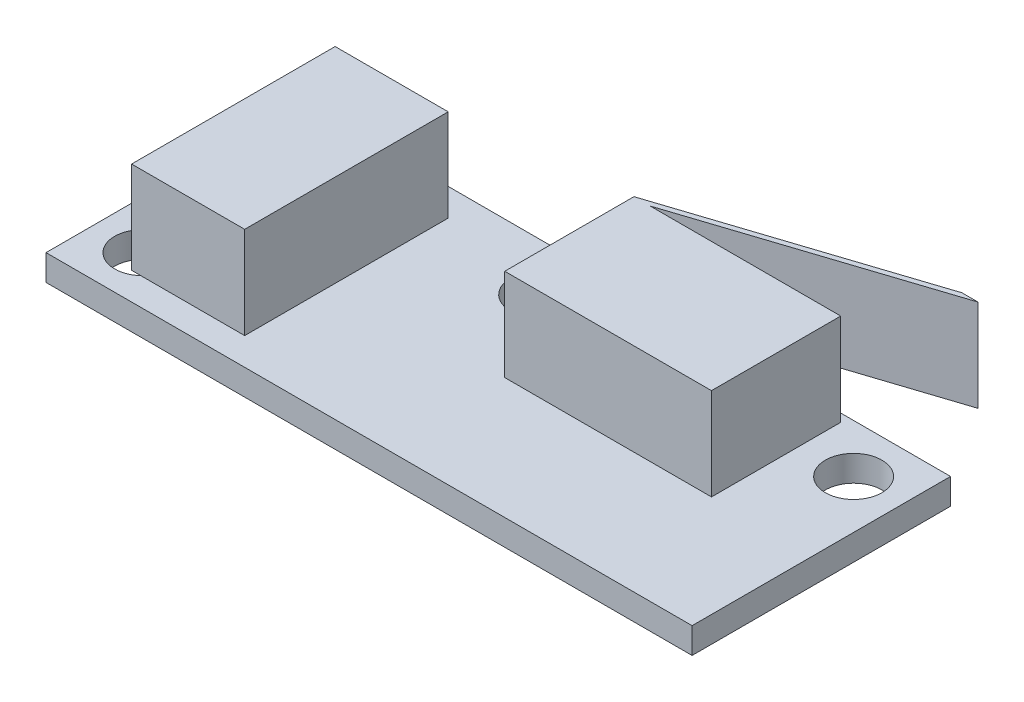
ISO-10303-21;
HEADER;
FILE_DESCRIPTION(('STEP AP214'),'2;1');
FILE_NAME('part.step','',(''),(''),'','','');
FILE_SCHEMA(('AUTOMOTIVE_DESIGN { 1 0 10303 214 1 1 1 1 }'));
ENDSEC;
DATA;
#1=APPLICATION_CONTEXT('core data for automotive mechanical design processes');
#2=APPLICATION_PROTOCOL_DEFINITION('international standard','automotive_design',2000,#1);
#3=PRODUCT_CONTEXT('',#1,'mechanical');
#4=PRODUCT('Part','Part','',(#3));
#5=PRODUCT_RELATED_PRODUCT_CATEGORY('part','',(#4));
#6=PRODUCT_DEFINITION_FORMATION('','',#4);
#7=PRODUCT_DEFINITION_CONTEXT('part definition',#1,'design');
#8=PRODUCT_DEFINITION('design','',#6,#7);
#9=PRODUCT_DEFINITION_SHAPE('','',#8);
#10=(LENGTH_UNIT() NAMED_UNIT(*) SI_UNIT(.MILLI.,.METRE.));
#11=(NAMED_UNIT(*) PLANE_ANGLE_UNIT() SI_UNIT($,.RADIAN.));
#12=(NAMED_UNIT(*) SI_UNIT($,.STERADIAN.) SOLID_ANGLE_UNIT());
#13=UNCERTAINTY_MEASURE_WITH_UNIT(LENGTH_MEASURE(1.E-05),#10,'distance_accuracy_value','');
#14=(GEOMETRIC_REPRESENTATION_CONTEXT(3) GLOBAL_UNCERTAINTY_ASSIGNED_CONTEXT((#13)) GLOBAL_UNIT_ASSIGNED_CONTEXT((#10,
#11,#12)) REPRESENTATION_CONTEXT('',''));
#15=CARTESIAN_POINT('',(0.,0.,0.));
#16=DIRECTION('',(0.,0.,1.));
#17=DIRECTION('',(1.,0.,0.));
#18=AXIS2_PLACEMENT_3D('',#15,#16,#17);
#19=CARTESIAN_POINT('',(0.,1.6,0.));
#20=DIRECTION('',(0.,1.,0.));
#21=DIRECTION('',(0.,0.,1.));
#22=AXIS2_PLACEMENT_3D('',#19,#20,#21);
#23=PLANE('',#22);
#24=DIRECTION('',(-0.950530606221033,0.,0.310630917065697));
#25=VECTOR('',#24,1.);
#26=CARTESIAN_POINT('',(0.9,1.6,-7.5));
#27=LINE('',#26,#25);
#28=CARTESIAN_POINT('',(2.43000000000001,1.6,-8.));
#29=VERTEX_POINT('',#28);
#30=CARTESIAN_POINT('',(0.9,1.6,-7.5));
#31=VERTEX_POINT('',#30);
#32=EDGE_CURVE('E11',#29,#31,#27,.T.);
#33=ORIENTED_EDGE('',*,*,#32,.F.);
#34=DIRECTION('',(-1.,0.,0.));
#35=VECTOR('',#34,1.);
#36=CARTESIAN_POINT('',(-20.,1.6,-8.));
#37=LINE('',#36,#35);
#38=CARTESIAN_POINT('',(-20.,1.6,-8.));
#39=VERTEX_POINT('',#38);
#40=EDGE_CURVE('E272',#29,#39,#37,.T.);
#41=ORIENTED_EDGE('',*,*,#40,.T.);
#42=DIRECTION('',(0.,0.,1.));
#43=VECTOR('',#42,1.);
#44=CARTESIAN_POINT('',(-20.,1.6,-8.));
#45=LINE('',#44,#43);
#46=CARTESIAN_POINT('',(-20.,1.6,8.));
#47=VERTEX_POINT('',#46);
#48=EDGE_CURVE('E277',#39,#47,#45,.T.);
#49=ORIENTED_EDGE('',*,*,#48,.T.);
#50=DIRECTION('',(1.,0.,0.));
#51=VECTOR('',#50,1.);
#52=CARTESIAN_POINT('',(-20.,1.6,8.));
#53=LINE('',#52,#51);
#54=CARTESIAN_POINT('',(20.,1.6,8.));
#55=VERTEX_POINT('',#54);
#56=EDGE_CURVE('E280',#47,#55,#53,.T.);
#57=ORIENTED_EDGE('',*,*,#56,.T.);
#58=DIRECTION('',(0.,0.,-1.));
#59=VECTOR('',#58,1.);
#60=CARTESIAN_POINT('',(20.,1.6,-8.));
#61=LINE('',#60,#59);
#62=CARTESIAN_POINT('',(20.,1.6,-8.));
#63=VERTEX_POINT('',#62);
#64=EDGE_CURVE('E269',#55,#63,#61,.T.);
#65=ORIENTED_EDGE('',*,*,#64,.T.);
#66=CARTESIAN_POINT('',(3.43000000000004,1.6,-8.00000000000001));
#67=VERTEX_POINT('',#66);
#68=EDGE_CURVE('E274',#63,#67,#37,.T.);
#69=ORIENTED_EDGE('',*,*,#68,.T.);
#70=DIRECTION('',(0.950530606221033,0.,-0.310630917065697));
#71=VECTOR('',#70,1.);
#72=CARTESIAN_POINT('',(17.2,1.6,-12.5));
#73=LINE('',#72,#71);
#74=CARTESIAN_POINT('',(1.9,1.6,-7.5));
#75=VERTEX_POINT('',#74);
#76=EDGE_CURVE('E216',#75,#67,#73,.T.);
#77=ORIENTED_EDGE('',*,*,#76,.F.);
#78=DIRECTION('',(-1.,0.,0.));
#79=VECTOR('',#78,1.);
#80=CARTESIAN_POINT('',(1.9,1.6,-7.5));
#81=LINE('',#80,#79);
#82=CARTESIAN_POINT('',(13.7,1.6,-7.5));
#83=VERTEX_POINT('',#82);
#84=EDGE_CURVE('E212',#83,#75,#81,.T.);
#85=ORIENTED_EDGE('',*,*,#84,.F.);
#86=DIRECTION('',(0.,0.,-1.));
#87=VECTOR('',#86,1.);
#88=CARTESIAN_POINT('',(13.7,1.6,-7.5));
#89=LINE('',#88,#87);
#90=CARTESIAN_POINT('',(13.7,1.6,0.499999999999999));
#91=VERTEX_POINT('',#90);
#92=EDGE_CURVE('E209',#91,#83,#89,.T.);
#93=ORIENTED_EDGE('',*,*,#92,.F.);
#94=DIRECTION('',(1.,0.,0.));
#95=VECTOR('',#94,1.);
#96=CARTESIAN_POINT('',(0.900000000000001,1.6,0.499999999999999));
#97=LINE('',#96,#95);
#98=CARTESIAN_POINT('',(0.900000000000001,1.6,0.499999999999999));
#99=VERTEX_POINT('',#98);
#100=EDGE_CURVE('E185',#99,#91,#97,.T.);
#101=ORIENTED_EDGE('',*,*,#100,.F.);
#102=DIRECTION('',(0.,0.,1.));
#103=VECTOR('',#102,1.);
#104=CARTESIAN_POINT('',(0.9,1.6,-7.5));
#105=LINE('',#104,#103);
#106=EDGE_CURVE('E58',#31,#99,#105,.T.);
#107=ORIENTED_EDGE('',*,*,#106,.F.);
#108=EDGE_LOOP('',(#33,#41,#49,#57,#65,#69,#77,#85,#93,#101,#107));
#109=FACE_BOUND('',#108,.T.);
#110=CARTESIAN_POINT('',(17.,1.6,-5.));
#111=DIRECTION('',(0.,1.,0.));
#112=DIRECTION('',(0.,0.,1.));
#113=AXIS2_PLACEMENT_3D('',#110,#111,#112);
#114=CIRCLE('',#113,1.75);
#115=CARTESIAN_POINT('',(17.,1.6,-3.25));
#116=VERTEX_POINT('',#115);
#117=EDGE_CURVE('E243',#116,#116,#114,.T.);
#118=ORIENTED_EDGE('',*,*,#117,.F.);
#119=EDGE_LOOP('',(#118));
#120=FACE_BOUND('',#119,.T.);
#121=CARTESIAN_POINT('',(-2.5,1.6,-5.));
#122=DIRECTION('',(0.,1.,0.));
#123=DIRECTION('',(0.,0.,1.));
#124=AXIS2_PLACEMENT_3D('',#121,#122,#123);
#125=CIRCLE('',#124,1.75);
#126=CARTESIAN_POINT('',(-2.5,1.6,-3.25));
#127=VERTEX_POINT('',#126);
#128=EDGE_CURVE('E249',#127,#127,#125,.T.);
#129=ORIENTED_EDGE('',*,*,#128,.F.);
#130=EDGE_LOOP('',(#129));
#131=FACE_BOUND('',#130,.T.);
#132=CARTESIAN_POINT('',(-17.,1.6,5.));
#133=DIRECTION('',(0.,1.,0.));
#134=DIRECTION('',(0.,0.,1.));
#135=AXIS2_PLACEMENT_3D('',#132,#133,#134);
#136=CIRCLE('',#135,1.75);
#137=CARTESIAN_POINT('',(-16.4,1.6,3.35607177772264));
#138=VERTEX_POINT('',#137);
#139=CARTESIAN_POINT('',(-15.828462548614,1.6,6.3));
#140=VERTEX_POINT('',#139);
#141=EDGE_CURVE('E259',#138,#140,#136,.T.);
#142=ORIENTED_EDGE('',*,*,#141,.F.);
#143=DIRECTION('',(0.,0.,1.));
#144=VECTOR('',#143,1.);
#145=CARTESIAN_POINT('',(-16.4,1.6,-6.3));
#146=LINE('',#145,#144);
#147=CARTESIAN_POINT('',(-16.4,1.6,-3.35607177772264));
#148=VERTEX_POINT('',#147);
#149=EDGE_CURVE('E50',#148,#138,#146,.T.);
#150=ORIENTED_EDGE('',*,*,#149,.F.);
#151=CARTESIAN_POINT('',(-17.,1.6,-5.));
#152=DIRECTION('',(0.,1.,0.));
#153=DIRECTION('',(0.,0.,1.));
#154=AXIS2_PLACEMENT_3D('',#151,#152,#153);
#155=CIRCLE('',#154,1.75);
#156=CARTESIAN_POINT('',(-15.828462548614,1.6,-6.3));
#157=VERTEX_POINT('',#156);
#158=EDGE_CURVE('E266',#157,#148,#155,.T.);
#159=ORIENTED_EDGE('',*,*,#158,.F.);
#160=DIRECTION('',(-1.,0.,0.));
#161=VECTOR('',#160,1.);
#162=CARTESIAN_POINT('',(-16.4,1.6,-6.3));
#163=LINE('',#162,#161);
#164=CARTESIAN_POINT('',(-9.4,1.6,-6.3));
#165=VERTEX_POINT('',#164);
#166=EDGE_CURVE('E179',#165,#157,#163,.T.);
#167=ORIENTED_EDGE('',*,*,#166,.F.);
#168=DIRECTION('',(0.,0.,-1.));
#169=VECTOR('',#168,1.);
#170=CARTESIAN_POINT('',(-9.4,1.6,-6.3));
#171=LINE('',#170,#169);
#172=CARTESIAN_POINT('',(-9.4,1.6,6.3));
#173=VERTEX_POINT('',#172);
#174=EDGE_CURVE('E563',#173,#165,#171,.T.);
#175=ORIENTED_EDGE('',*,*,#174,.F.);
#176=DIRECTION('',(1.,0.,0.));
#177=VECTOR('',#176,1.);
#178=CARTESIAN_POINT('',(-16.4,1.6,6.3));
#179=LINE('',#178,#177);
#180=EDGE_CURVE('E556',#140,#173,#179,.T.);
#181=ORIENTED_EDGE('',*,*,#180,.F.);
#182=EDGE_LOOP('',(#142,#150,#159,#167,#175,#181));
#183=FACE_BOUND('',#182,.T.);
#184=ADVANCED_FACE('F33',(#109,#120,#131,#183),#23,.T.);
#185=CARTESIAN_POINT('',(20.,1.6,-8.));
#186=DIRECTION('',(-1.,0.,0.));
#187=DIRECTION('',(0.,0.,1.));
#188=AXIS2_PLACEMENT_3D('',#185,#186,#187);
#189=PLANE('',#188);
#190=DIRECTION('',(0.,0.,-1.));
#191=VECTOR('',#190,1.);
#192=CARTESIAN_POINT('',(20.,0.,-8.));
#193=LINE('',#192,#191);
#194=CARTESIAN_POINT('',(20.,0.,8.));
#195=VERTEX_POINT('',#194);
#196=CARTESIAN_POINT('',(20.,0.,-8.));
#197=VERTEX_POINT('',#196);
#198=EDGE_CURVE('E265',#195,#197,#193,.T.);
#199=ORIENTED_EDGE('',*,*,#198,.T.);
#200=DIRECTION('',(0.,-1.,0.));
#201=VECTOR('',#200,1.);
#202=CARTESIAN_POINT('',(20.,1.6,-8.));
#203=LINE('',#202,#201);
#204=EDGE_CURVE('E37',#63,#197,#203,.T.);
#205=ORIENTED_EDGE('',*,*,#204,.F.);
#206=ORIENTED_EDGE('',*,*,#64,.F.);
#207=DIRECTION('',(0.,-1.,0.));
#208=VECTOR('',#207,1.);
#209=CARTESIAN_POINT('',(20.,1.6,8.));
#210=LINE('',#209,#208);
#211=EDGE_CURVE('E282',#55,#195,#210,.T.);
#212=ORIENTED_EDGE('',*,*,#211,.T.);
#213=EDGE_LOOP('',(#199,#205,#206,#212));
#214=FACE_BOUND('',#213,.T.);
#215=ADVANCED_FACE('F35',(#214),#189,.F.);
#216=CARTESIAN_POINT('',(-20.,1.6,-8.));
#217=DIRECTION('',(0.,0.,1.));
#218=DIRECTION('',(1.,0.,0.));
#219=AXIS2_PLACEMENT_3D('',#216,#217,#218);
#220=PLANE('',#219);
#221=DIRECTION('',(-1.,0.,0.));
#222=VECTOR('',#221,1.);
#223=CARTESIAN_POINT('',(-20.,0.,-8.));
#224=LINE('',#223,#222);
#225=CARTESIAN_POINT('',(-20.,0.,-8.));
#226=VERTEX_POINT('',#225);
#227=EDGE_CURVE('E285',#197,#226,#224,.T.);
#228=ORIENTED_EDGE('',*,*,#227,.T.);
#229=DIRECTION('',(0.,-1.,0.));
#230=VECTOR('',#229,1.);
#231=CARTESIAN_POINT('',(-20.,1.6,-8.));
#232=LINE('',#231,#230);
#233=EDGE_CURVE('E294',#39,#226,#232,.T.);
#234=ORIENTED_EDGE('',*,*,#233,.F.);
#235=ORIENTED_EDGE('',*,*,#40,.F.);
#236=EDGE_CURVE('E278',#67,#29,#37,.T.);
#237=ORIENTED_EDGE('',*,*,#236,.F.);
#238=ORIENTED_EDGE('',*,*,#68,.F.);
#239=ORIENTED_EDGE('',*,*,#204,.T.);
#240=EDGE_LOOP('',(#228,#234,#235,#237,#238,#239));
#241=FACE_BOUND('',#240,.T.);
#242=ADVANCED_FACE('F303',(#241),#220,.F.);
#243=CARTESIAN_POINT('',(-20.,1.6,-8.));
#244=DIRECTION('',(1.,0.,0.));
#245=DIRECTION('',(0.,0.,-1.));
#246=AXIS2_PLACEMENT_3D('',#243,#244,#245);
#247=PLANE('',#246);
#248=DIRECTION('',(0.,0.,1.));
#249=VECTOR('',#248,1.);
#250=CARTESIAN_POINT('',(-20.,0.,-8.));
#251=LINE('',#250,#249);
#252=CARTESIAN_POINT('',(-20.,0.,8.));
#253=VERTEX_POINT('',#252);
#254=EDGE_CURVE('E287',#226,#253,#251,.T.);
#255=ORIENTED_EDGE('',*,*,#254,.T.);
#256=DIRECTION('',(0.,-1.,0.));
#257=VECTOR('',#256,1.);
#258=CARTESIAN_POINT('',(-20.,1.6,8.));
#259=LINE('',#258,#257);
#260=EDGE_CURVE('E292',#47,#253,#259,.T.);
#261=ORIENTED_EDGE('',*,*,#260,.F.);
#262=ORIENTED_EDGE('',*,*,#48,.F.);
#263=ORIENTED_EDGE('',*,*,#233,.T.);
#264=EDGE_LOOP('',(#255,#261,#262,#263));
#265=FACE_BOUND('',#264,.T.);
#266=ADVANCED_FACE('F312',(#265),#247,.F.);
#267=CARTESIAN_POINT('',(-20.,1.6,8.));
#268=DIRECTION('',(0.,0.,-1.));
#269=DIRECTION('',(-1.,0.,0.));
#270=AXIS2_PLACEMENT_3D('',#267,#268,#269);
#271=PLANE('',#270);
#272=DIRECTION('',(1.,0.,0.));
#273=VECTOR('',#272,1.);
#274=CARTESIAN_POINT('',(-20.,0.,8.));
#275=LINE('',#274,#273);
#276=EDGE_CURVE('E273',#253,#195,#275,.T.);
#277=ORIENTED_EDGE('',*,*,#276,.T.);
#278=ORIENTED_EDGE('',*,*,#211,.F.);
#279=ORIENTED_EDGE('',*,*,#56,.F.);
#280=ORIENTED_EDGE('',*,*,#260,.T.);
#281=EDGE_LOOP('',(#277,#278,#279,#280));
#282=FACE_BOUND('',#281,.T.);
#283=ADVANCED_FACE('F315',(#282),#271,.F.);
#284=CARTESIAN_POINT('',(0.,0.,0.));
#285=DIRECTION('',(0.,1.,0.));
#286=DIRECTION('',(0.,0.,1.));
#287=AXIS2_PLACEMENT_3D('',#284,#285,#286);
#288=PLANE('',#287);
#289=CARTESIAN_POINT('',(17.,0.,-5.));
#290=DIRECTION('',(0.,1.,0.));
#291=DIRECTION('',(0.,0.,1.));
#292=AXIS2_PLACEMENT_3D('',#289,#290,#291);
#293=CIRCLE('',#292,1.75);
#294=CARTESIAN_POINT('',(17.,0.,-3.25));
#295=VERTEX_POINT('',#294);
#296=EDGE_CURVE('E242',#295,#295,#293,.T.);
#297=ORIENTED_EDGE('',*,*,#296,.T.);
#298=EDGE_LOOP('',(#297));
#299=FACE_BOUND('',#298,.T.);
#300=CARTESIAN_POINT('',(-2.5,0.,-5.));
#301=DIRECTION('',(0.,1.,0.));
#302=DIRECTION('',(0.,0.,1.));
#303=AXIS2_PLACEMENT_3D('',#300,#301,#302);
#304=CIRCLE('',#303,1.75);
#305=CARTESIAN_POINT('',(-2.5,0.,-3.25));
#306=VERTEX_POINT('',#305);
#307=EDGE_CURVE('E246',#306,#306,#304,.T.);
#308=ORIENTED_EDGE('',*,*,#307,.T.);
#309=EDGE_LOOP('',(#308));
#310=FACE_BOUND('',#309,.T.);
#311=CARTESIAN_POINT('',(-17.,0.,5.));
#312=DIRECTION('',(0.,1.,0.));
#313=DIRECTION('',(0.,0.,1.));
#314=AXIS2_PLACEMENT_3D('',#311,#312,#313);
#315=CIRCLE('',#314,1.75);
#316=CARTESIAN_POINT('',(-17.,0.,6.75));
#317=VERTEX_POINT('',#316);
#318=EDGE_CURVE('E252',#317,#317,#315,.T.);
#319=ORIENTED_EDGE('',*,*,#318,.T.);
#320=EDGE_LOOP('',(#319));
#321=FACE_BOUND('',#320,.T.);
#322=CARTESIAN_POINT('',(-17.,0.,-5.));
#323=DIRECTION('',(0.,1.,0.));
#324=DIRECTION('',(0.,0.,1.));
#325=AXIS2_PLACEMENT_3D('',#322,#323,#324);
#326=CIRCLE('',#325,1.75);
#327=CARTESIAN_POINT('',(-17.,0.,-3.25));
#328=VERTEX_POINT('',#327);
#329=EDGE_CURVE('E258',#328,#328,#326,.T.);
#330=ORIENTED_EDGE('',*,*,#329,.T.);
#331=EDGE_LOOP('',(#330));
#332=FACE_BOUND('',#331,.T.);
#333=ORIENTED_EDGE('',*,*,#198,.F.);
#334=ORIENTED_EDGE('',*,*,#276,.F.);
#335=ORIENTED_EDGE('',*,*,#254,.F.);
#336=ORIENTED_EDGE('',*,*,#227,.F.);
#337=EDGE_LOOP('',(#333,#334,#335,#336));
#338=FACE_BOUND('',#337,.T.);
#339=ADVANCED_FACE('F310',(#299,#310,#321,#332,#338),#288,.F.);
#340=CARTESIAN_POINT('',(-17.,1.6,-5.));
#341=DIRECTION('',(0.,-1.,0.));
#342=DIRECTION('',(0.,0.,-1.));
#343=AXIS2_PLACEMENT_3D('',#340,#341,#342);
#344=CYLINDRICAL_SURFACE('',#343,1.75);
#345=EDGE_CURVE('E262',#148,#157,#155,.T.);
#346=ORIENTED_EDGE('',*,*,#345,.T.);
#347=ORIENTED_EDGE('',*,*,#158,.T.);
#348=EDGE_LOOP('',(#346,#347));
#349=FACE_BOUND('',#348,.T.);
#350=ORIENTED_EDGE('',*,*,#329,.F.);
#351=EDGE_LOOP('',(#350));
#352=FACE_BOUND('',#351,.T.);
#353=ADVANCED_FACE('F373',(#349,#352),#344,.F.);
#354=CARTESIAN_POINT('',(-17.,1.6,5.));
#355=DIRECTION('',(0.,-1.,0.));
#356=DIRECTION('',(0.,0.,-1.));
#357=AXIS2_PLACEMENT_3D('',#354,#355,#356);
#358=CYLINDRICAL_SURFACE('',#357,1.75);
#359=EDGE_CURVE('E255',#140,#138,#136,.T.);
#360=ORIENTED_EDGE('',*,*,#359,.T.);
#361=ORIENTED_EDGE('',*,*,#141,.T.);
#362=EDGE_LOOP('',(#360,#361));
#363=FACE_BOUND('',#362,.T.);
#364=ORIENTED_EDGE('',*,*,#318,.F.);
#365=EDGE_LOOP('',(#364));
#366=FACE_BOUND('',#365,.T.);
#367=ADVANCED_FACE('F407',(#363,#366),#358,.F.);
#368=CARTESIAN_POINT('',(-2.5,1.6,-5.));
#369=DIRECTION('',(0.,-1.,0.));
#370=DIRECTION('',(0.,0.,-1.));
#371=AXIS2_PLACEMENT_3D('',#368,#369,#370);
#372=CYLINDRICAL_SURFACE('',#371,1.75);
#373=ORIENTED_EDGE('',*,*,#128,.T.);
#374=EDGE_LOOP('',(#373));
#375=FACE_BOUND('',#374,.T.);
#376=ORIENTED_EDGE('',*,*,#307,.F.);
#377=EDGE_LOOP('',(#376));
#378=FACE_BOUND('',#377,.T.);
#379=ADVANCED_FACE('F414',(#375,#378),#372,.F.);
#380=CARTESIAN_POINT('',(17.,1.6,-5.));
#381=DIRECTION('',(0.,-1.,0.));
#382=DIRECTION('',(0.,0.,-1.));
#383=AXIS2_PLACEMENT_3D('',#380,#381,#382);
#384=CYLINDRICAL_SURFACE('',#383,1.75);
#385=ORIENTED_EDGE('',*,*,#117,.T.);
#386=EDGE_LOOP('',(#385));
#387=FACE_BOUND('',#386,.T.);
#388=ORIENTED_EDGE('',*,*,#296,.F.);
#389=EDGE_LOOP('',(#388));
#390=FACE_BOUND('',#389,.T.);
#391=ADVANCED_FACE('F421',(#387,#390),#384,.F.);
#392=CARTESIAN_POINT('',(0.,1.6,0.));
#393=DIRECTION('',(0.,1.,0.));
#394=DIRECTION('',(0.,0.,1.));
#395=AXIS2_PLACEMENT_3D('',#392,#393,#394);
#396=PLANE('',#395);
#397=CARTESIAN_POINT('',(17.2,1.6,-12.5));
#398=VERTEX_POINT('',#397);
#399=EDGE_CURVE('E215',#67,#398,#73,.T.);
#400=ORIENTED_EDGE('',*,*,#399,.F.);
#401=ORIENTED_EDGE('',*,*,#236,.T.);
#402=CARTESIAN_POINT('',(16.2,1.6,-12.5));
#403=VERTEX_POINT('',#402);
#404=EDGE_CURVE('E43',#403,#29,#27,.T.);
#405=ORIENTED_EDGE('',*,*,#404,.F.);
#406=DIRECTION('',(-1.,0.,0.));
#407=VECTOR('',#406,1.);
#408=CARTESIAN_POINT('',(16.2,1.6,-12.5));
#409=LINE('',#408,#407);
#410=EDGE_CURVE('E219',#398,#403,#409,.T.);
#411=ORIENTED_EDGE('',*,*,#410,.F.);
#412=EDGE_LOOP('',(#400,#401,#405,#411));
#413=FACE_BOUND('',#412,.T.);
#414=ADVANCED_FACE('F322',(#413),#396,.F.);
#415=CARTESIAN_POINT('',(0.9,7.3,-7.5));
#416=DIRECTION('',(1.,0.,0.));
#417=DIRECTION('',(0.,0.,-1.));
#418=AXIS2_PLACEMENT_3D('',#415,#416,#417);
#419=PLANE('',#418);
#420=ORIENTED_EDGE('',*,*,#106,.T.);
#421=DIRECTION('',(0.,-1.,0.));
#422=VECTOR('',#421,1.);
#423=CARTESIAN_POINT('',(0.900000000000001,7.3,0.499999999999999));
#424=LINE('',#423,#422);
#425=CARTESIAN_POINT('',(0.900000000000001,7.3,0.499999999999999));
#426=VERTEX_POINT('',#425);
#427=EDGE_CURVE('E239',#426,#99,#424,.T.);
#428=ORIENTED_EDGE('',*,*,#427,.F.);
#429=DIRECTION('',(0.,0.,1.));
#430=VECTOR('',#429,1.);
#431=CARTESIAN_POINT('',(0.9,7.3,-7.5));
#432=LINE('',#431,#430);
#433=CARTESIAN_POINT('',(0.9,7.3,-7.5));
#434=VERTEX_POINT('',#433);
#435=EDGE_CURVE('E191',#434,#426,#432,.T.);
#436=ORIENTED_EDGE('',*,*,#435,.F.);
#437=DIRECTION('',(0.,-1.,0.));
#438=VECTOR('',#437,1.);
#439=CARTESIAN_POINT('',(0.9,7.3,-7.5));
#440=LINE('',#439,#438);
#441=EDGE_CURVE('E205',#434,#31,#440,.T.);
#442=ORIENTED_EDGE('',*,*,#441,.T.);
#443=EDGE_LOOP('',(#420,#428,#436,#442));
#444=FACE_BOUND('',#443,.T.);
#445=ADVANCED_FACE('F350',(#444),#419,.F.);
#446=CARTESIAN_POINT('',(0.900000000000001,7.3,0.499999999999999));
#447=DIRECTION('',(0.,0.,-1.));
#448=DIRECTION('',(-1.,0.,0.));
#449=AXIS2_PLACEMENT_3D('',#446,#447,#448);
#450=PLANE('',#449);
#451=ORIENTED_EDGE('',*,*,#100,.T.);
#452=DIRECTION('',(0.,-1.,0.));
#453=VECTOR('',#452,1.);
#454=CARTESIAN_POINT('',(13.7,7.3,0.499999999999999));
#455=LINE('',#454,#453);
#456=CARTESIAN_POINT('',(13.7,7.3,0.499999999999999));
#457=VERTEX_POINT('',#456);
#458=EDGE_CURVE('E236',#457,#91,#455,.T.);
#459=ORIENTED_EDGE('',*,*,#458,.F.);
#460=DIRECTION('',(1.,0.,0.));
#461=VECTOR('',#460,1.);
#462=CARTESIAN_POINT('',(0.900000000000001,7.3,0.499999999999999));
#463=LINE('',#462,#461);
#464=EDGE_CURVE('E194',#426,#457,#463,.T.);
#465=ORIENTED_EDGE('',*,*,#464,.F.);
#466=ORIENTED_EDGE('',*,*,#427,.T.);
#467=EDGE_LOOP('',(#451,#459,#465,#466));
#468=FACE_BOUND('',#467,.T.);
#469=ADVANCED_FACE('F346',(#468),#450,.F.);
#470=CARTESIAN_POINT('',(13.7,7.3,-7.5));
#471=DIRECTION('',(-1.,0.,0.));
#472=DIRECTION('',(0.,0.,1.));
#473=AXIS2_PLACEMENT_3D('',#470,#471,#472);
#474=PLANE('',#473);
#475=ORIENTED_EDGE('',*,*,#92,.T.);
#476=DIRECTION('',(0.,-1.,0.));
#477=VECTOR('',#476,1.);
#478=CARTESIAN_POINT('',(13.7,7.3,-7.5));
#479=LINE('',#478,#477);
#480=CARTESIAN_POINT('',(13.7,7.3,-7.5));
#481=VERTEX_POINT('',#480);
#482=EDGE_CURVE('E233',#481,#83,#479,.T.);
#483=ORIENTED_EDGE('',*,*,#482,.F.);
#484=DIRECTION('',(0.,0.,-1.));
#485=VECTOR('',#484,1.);
#486=CARTESIAN_POINT('',(13.7,7.3,-7.5));
#487=LINE('',#486,#485);
#488=EDGE_CURVE('E196',#457,#481,#487,.T.);
#489=ORIENTED_EDGE('',*,*,#488,.F.);
#490=ORIENTED_EDGE('',*,*,#458,.T.);
#491=EDGE_LOOP('',(#475,#483,#489,#490));
#492=FACE_BOUND('',#491,.T.);
#493=ADVANCED_FACE('F343',(#492),#474,.F.);
#494=CARTESIAN_POINT('',(1.9,7.3,-7.5));
#495=DIRECTION('',(0.,0.,1.));
#496=DIRECTION('',(1.,0.,0.));
#497=AXIS2_PLACEMENT_3D('',#494,#495,#496);
#498=PLANE('',#497);
#499=ORIENTED_EDGE('',*,*,#84,.T.);
#500=DIRECTION('',(0.,-1.,0.));
#501=VECTOR('',#500,1.);
#502=CARTESIAN_POINT('',(1.9,7.3,-7.5));
#503=LINE('',#502,#501);
#504=CARTESIAN_POINT('',(1.9,7.3,-7.5));
#505=VERTEX_POINT('',#504);
#506=EDGE_CURVE('E230',#505,#75,#503,.T.);
#507=ORIENTED_EDGE('',*,*,#506,.F.);
#508=DIRECTION('',(-1.,0.,0.));
#509=VECTOR('',#508,1.);
#510=CARTESIAN_POINT('',(1.9,7.3,-7.5));
#511=LINE('',#510,#509);
#512=EDGE_CURVE('E198',#481,#505,#511,.T.);
#513=ORIENTED_EDGE('',*,*,#512,.F.);
#514=ORIENTED_EDGE('',*,*,#482,.T.);
#515=EDGE_LOOP('',(#499,#507,#513,#514));
#516=FACE_BOUND('',#515,.T.);
#517=ADVANCED_FACE('F338',(#516),#498,.F.);
#518=CARTESIAN_POINT('',(17.2,7.3,-12.5));
#519=DIRECTION('',(-0.310630917065697,0.,-0.950530606221033));
#520=DIRECTION('',(-0.950530606221033,0.,0.310630917065697));
#521=AXIS2_PLACEMENT_3D('',#518,#519,#520);
#522=PLANE('',#521);
#523=ORIENTED_EDGE('',*,*,#76,.T.);
#524=ORIENTED_EDGE('',*,*,#399,.T.);
#525=DIRECTION('',(0.,-1.,0.));
#526=VECTOR('',#525,1.);
#527=CARTESIAN_POINT('',(17.2,7.3,-12.5));
#528=LINE('',#527,#526);
#529=CARTESIAN_POINT('',(17.2,7.3,-12.5));
#530=VERTEX_POINT('',#529);
#531=EDGE_CURVE('E227',#530,#398,#528,.T.);
#532=ORIENTED_EDGE('',*,*,#531,.F.);
#533=DIRECTION('',(0.950530606221033,0.,-0.310630917065697));
#534=VECTOR('',#533,1.);
#535=CARTESIAN_POINT('',(17.2,7.3,-12.5));
#536=LINE('',#535,#534);
#537=EDGE_CURVE('E200',#505,#530,#536,.T.);
#538=ORIENTED_EDGE('',*,*,#537,.F.);
#539=ORIENTED_EDGE('',*,*,#506,.T.);
#540=EDGE_LOOP('',(#523,#524,#532,#538,#539));
#541=FACE_BOUND('',#540,.T.);
#542=ADVANCED_FACE('F335',(#541),#522,.F.);
#543=CARTESIAN_POINT('',(16.2,7.3,-12.5));
#544=DIRECTION('',(0.,0.,1.));
#545=DIRECTION('',(1.,0.,0.));
#546=AXIS2_PLACEMENT_3D('',#543,#544,#545);
#547=PLANE('',#546);
#548=ORIENTED_EDGE('',*,*,#410,.T.);
#549=DIRECTION('',(0.,-1.,0.));
#550=VECTOR('',#549,1.);
#551=CARTESIAN_POINT('',(16.2,7.3,-12.5));
#552=LINE('',#551,#550);
#553=CARTESIAN_POINT('',(16.2,7.3,-12.5));
#554=VERTEX_POINT('',#553);
#555=EDGE_CURVE('E224',#554,#403,#552,.T.);
#556=ORIENTED_EDGE('',*,*,#555,.F.);
#557=DIRECTION('',(-1.,0.,0.));
#558=VECTOR('',#557,1.);
#559=CARTESIAN_POINT('',(16.2,7.3,-12.5));
#560=LINE('',#559,#558);
#561=EDGE_CURVE('E202',#530,#554,#560,.T.);
#562=ORIENTED_EDGE('',*,*,#561,.F.);
#563=ORIENTED_EDGE('',*,*,#531,.T.);
#564=EDGE_LOOP('',(#548,#556,#562,#563));
#565=FACE_BOUND('',#564,.T.);
#566=ADVANCED_FACE('F331',(#565),#547,.F.);
#567=CARTESIAN_POINT('',(0.9,7.3,-7.5));
#568=DIRECTION('',(0.310630917065697,0.,0.950530606221033));
#569=DIRECTION('',(0.950530606221033,0.,-0.310630917065697));
#570=AXIS2_PLACEMENT_3D('',#567,#568,#569);
#571=PLANE('',#570);
#572=ORIENTED_EDGE('',*,*,#404,.T.);
#573=ORIENTED_EDGE('',*,*,#32,.T.);
#574=ORIENTED_EDGE('',*,*,#441,.F.);
#575=DIRECTION('',(-0.950530606221033,0.,0.310630917065697));
#576=VECTOR('',#575,1.);
#577=CARTESIAN_POINT('',(0.9,7.3,-7.5));
#578=LINE('',#577,#576);
#579=EDGE_CURVE('E204',#554,#434,#578,.T.);
#580=ORIENTED_EDGE('',*,*,#579,.F.);
#581=ORIENTED_EDGE('',*,*,#555,.T.);
#582=EDGE_LOOP('',(#572,#573,#574,#580,#581));
#583=FACE_BOUND('',#582,.T.);
#584=ADVANCED_FACE('F325',(#583),#571,.F.);
#585=CARTESIAN_POINT('',(0.,7.3,0.));
#586=DIRECTION('',(0.,1.,0.));
#587=DIRECTION('',(0.,0.,1.));
#588=AXIS2_PLACEMENT_3D('',#585,#586,#587);
#589=PLANE('',#588);
#590=ORIENTED_EDGE('',*,*,#435,.T.);
#591=ORIENTED_EDGE('',*,*,#464,.T.);
#592=ORIENTED_EDGE('',*,*,#488,.T.);
#593=ORIENTED_EDGE('',*,*,#512,.T.);
#594=ORIENTED_EDGE('',*,*,#537,.T.);
#595=ORIENTED_EDGE('',*,*,#561,.T.);
#596=ORIENTED_EDGE('',*,*,#579,.T.);
#597=EDGE_LOOP('',(#590,#591,#592,#593,#594,#595,#596));
#598=FACE_BOUND('',#597,.T.);
#599=ADVANCED_FACE('F352',(#598),#589,.T.);
#600=CARTESIAN_POINT('',(0.,1.6,0.));
#601=DIRECTION('',(0.,1.,0.));
#602=DIRECTION('',(0.,0.,1.));
#603=AXIS2_PLACEMENT_3D('',#600,#601,#602);
#604=PLANE('',#603);
#605=ORIENTED_EDGE('',*,*,#345,.F.);
#606=CARTESIAN_POINT('',(-16.4,1.6,-6.3));
#607=VERTEX_POINT('',#606);
#608=EDGE_CURVE('E554',#607,#148,#146,.T.);
#609=ORIENTED_EDGE('',*,*,#608,.F.);
#610=EDGE_CURVE('E545',#157,#607,#163,.T.);
#611=ORIENTED_EDGE('',*,*,#610,.F.);
#612=EDGE_LOOP('',(#605,#609,#611));
#613=FACE_BOUND('',#612,.T.);
#614=ADVANCED_FACE('F354',(#613),#604,.F.);
#615=ORIENTED_EDGE('',*,*,#359,.F.);
#616=CARTESIAN_POINT('',(-16.4,1.6,6.3));
#617=VERTEX_POINT('',#616);
#618=EDGE_CURVE('E558',#617,#140,#179,.T.);
#619=ORIENTED_EDGE('',*,*,#618,.F.);
#620=EDGE_CURVE('E182',#138,#617,#146,.T.);
#621=ORIENTED_EDGE('',*,*,#620,.F.);
#622=EDGE_LOOP('',(#615,#619,#621));
#623=FACE_BOUND('',#622,.T.);
#624=ADVANCED_FACE('F360',(#623),#604,.F.);
#625=CARTESIAN_POINT('',(-16.4,7.3,-6.3));
#626=DIRECTION('',(1.,0.,0.));
#627=DIRECTION('',(0.,0.,-1.));
#628=AXIS2_PLACEMENT_3D('',#625,#626,#627);
#629=PLANE('',#628);
#630=ORIENTED_EDGE('',*,*,#608,.T.);
#631=ORIENTED_EDGE('',*,*,#149,.T.);
#632=ORIENTED_EDGE('',*,*,#620,.T.);
#633=DIRECTION('',(0.,-1.,0.));
#634=VECTOR('',#633,1.);
#635=CARTESIAN_POINT('',(-16.4,7.3,6.3));
#636=LINE('',#635,#634);
#637=CARTESIAN_POINT('',(-16.4,7.3,6.3));
#638=VERTEX_POINT('',#637);
#639=EDGE_CURVE('E165',#638,#617,#636,.T.);
#640=ORIENTED_EDGE('',*,*,#639,.F.);
#641=DIRECTION('',(0.,0.,1.));
#642=VECTOR('',#641,1.);
#643=CARTESIAN_POINT('',(-16.4,7.3,-6.3));
#644=LINE('',#643,#642);
#645=CARTESIAN_POINT('',(-16.4,7.3,-6.3));
#646=VERTEX_POINT('',#645);
#647=EDGE_CURVE('E171',#646,#638,#644,.T.);
#648=ORIENTED_EDGE('',*,*,#647,.F.);
#649=DIRECTION('',(0.,-1.,0.));
#650=VECTOR('',#649,1.);
#651=CARTESIAN_POINT('',(-16.4,7.3,-6.3));
#652=LINE('',#651,#650);
#653=EDGE_CURVE('E555',#646,#607,#652,.T.);
#654=ORIENTED_EDGE('',*,*,#653,.T.);
#655=EDGE_LOOP('',(#630,#631,#632,#640,#648,#654));
#656=FACE_BOUND('',#655,.T.);
#657=ADVANCED_FACE('F181',(#656),#629,.F.);
#658=CARTESIAN_POINT('',(-16.4,7.3,6.3));
#659=DIRECTION('',(0.,0.,-1.));
#660=DIRECTION('',(-1.,0.,0.));
#661=AXIS2_PLACEMENT_3D('',#658,#659,#660);
#662=PLANE('',#661);
#663=ORIENTED_EDGE('',*,*,#618,.T.);
#664=ORIENTED_EDGE('',*,*,#180,.T.);
#665=DIRECTION('',(0.,-1.,0.));
#666=VECTOR('',#665,1.);
#667=CARTESIAN_POINT('',(-9.4,7.3,6.3));
#668=LINE('',#667,#666);
#669=CARTESIAN_POINT('',(-9.4,7.3,6.3));
#670=VERTEX_POINT('',#669);
#671=EDGE_CURVE('E167',#670,#173,#668,.T.);
#672=ORIENTED_EDGE('',*,*,#671,.F.);
#673=DIRECTION('',(1.,0.,0.));
#674=VECTOR('',#673,1.);
#675=CARTESIAN_POINT('',(-16.4,7.3,6.3));
#676=LINE('',#675,#674);
#677=EDGE_CURVE('E160',#638,#670,#676,.T.);
#678=ORIENTED_EDGE('',*,*,#677,.F.);
#679=ORIENTED_EDGE('',*,*,#639,.T.);
#680=EDGE_LOOP('',(#663,#664,#672,#678,#679));
#681=FACE_BOUND('',#680,.T.);
#682=ADVANCED_FACE('F163',(#681),#662,.F.);
#683=CARTESIAN_POINT('',(-9.4,7.3,-6.3));
#684=DIRECTION('',(-1.,0.,0.));
#685=DIRECTION('',(0.,0.,1.));
#686=AXIS2_PLACEMENT_3D('',#683,#684,#685);
#687=PLANE('',#686);
#688=ORIENTED_EDGE('',*,*,#174,.T.);
#689=DIRECTION('',(0.,-1.,0.));
#690=VECTOR('',#689,1.);
#691=CARTESIAN_POINT('',(-9.4,7.3,-6.3));
#692=LINE('',#691,#690);
#693=CARTESIAN_POINT('',(-9.4,7.3,-6.3));
#694=VERTEX_POINT('',#693);
#695=EDGE_CURVE('E187',#694,#165,#692,.T.);
#696=ORIENTED_EDGE('',*,*,#695,.F.);
#697=DIRECTION('',(0.,0.,-1.));
#698=VECTOR('',#697,1.);
#699=CARTESIAN_POINT('',(-9.4,7.3,-6.3));
#700=LINE('',#699,#698);
#701=EDGE_CURVE('E170',#670,#694,#700,.T.);
#702=ORIENTED_EDGE('',*,*,#701,.F.);
#703=ORIENTED_EDGE('',*,*,#671,.T.);
#704=EDGE_LOOP('',(#688,#696,#702,#703));
#705=FACE_BOUND('',#704,.T.);
#706=ADVANCED_FACE('F508',(#705),#687,.F.);
#707=CARTESIAN_POINT('',(-16.4,7.3,-6.3));
#708=DIRECTION('',(0.,0.,1.));
#709=DIRECTION('',(1.,0.,0.));
#710=AXIS2_PLACEMENT_3D('',#707,#708,#709);
#711=PLANE('',#710);
#712=ORIENTED_EDGE('',*,*,#166,.T.);
#713=ORIENTED_EDGE('',*,*,#610,.T.);
#714=ORIENTED_EDGE('',*,*,#653,.F.);
#715=DIRECTION('',(-1.,0.,0.));
#716=VECTOR('',#715,1.);
#717=CARTESIAN_POINT('',(-16.4,7.3,-6.3));
#718=LINE('',#717,#716);
#719=EDGE_CURVE('E176',#694,#646,#718,.T.);
#720=ORIENTED_EDGE('',*,*,#719,.F.);
#721=ORIENTED_EDGE('',*,*,#695,.T.);
#722=EDGE_LOOP('',(#712,#713,#714,#720,#721));
#723=FACE_BOUND('',#722,.T.);
#724=ADVANCED_FACE('F516',(#723),#711,.F.);
#725=CARTESIAN_POINT('',(0.,7.3,0.));
#726=DIRECTION('',(0.,1.,0.));
#727=DIRECTION('',(0.,0.,1.));
#728=AXIS2_PLACEMENT_3D('',#725,#726,#727);
#729=PLANE('',#728);
#730=ORIENTED_EDGE('',*,*,#647,.T.);
#731=ORIENTED_EDGE('',*,*,#677,.T.);
#732=ORIENTED_EDGE('',*,*,#701,.T.);
#733=ORIENTED_EDGE('',*,*,#719,.T.);
#734=EDGE_LOOP('',(#730,#731,#732,#733));
#735=FACE_BOUND('',#734,.T.);
#736=ADVANCED_FACE('F174',(#735),#729,.T.);
#737=CLOSED_SHELL('',(#184,#215,#242,#266,#283,#339,#353,#367,#379,#391,#414,#445,#469,#493,
#517,#542,#566,#584,#599,#614,#624,#657,#682,#706,#724,#736));
#738=MANIFOLD_SOLID_BREP('B2',#737);
#739=ADVANCED_BREP_SHAPE_REPRESENTATION('',(#18,#738),#14);
#740=SHAPE_DEFINITION_REPRESENTATION(#9,#739);
ENDSEC;
END-ISO-10303-21;
